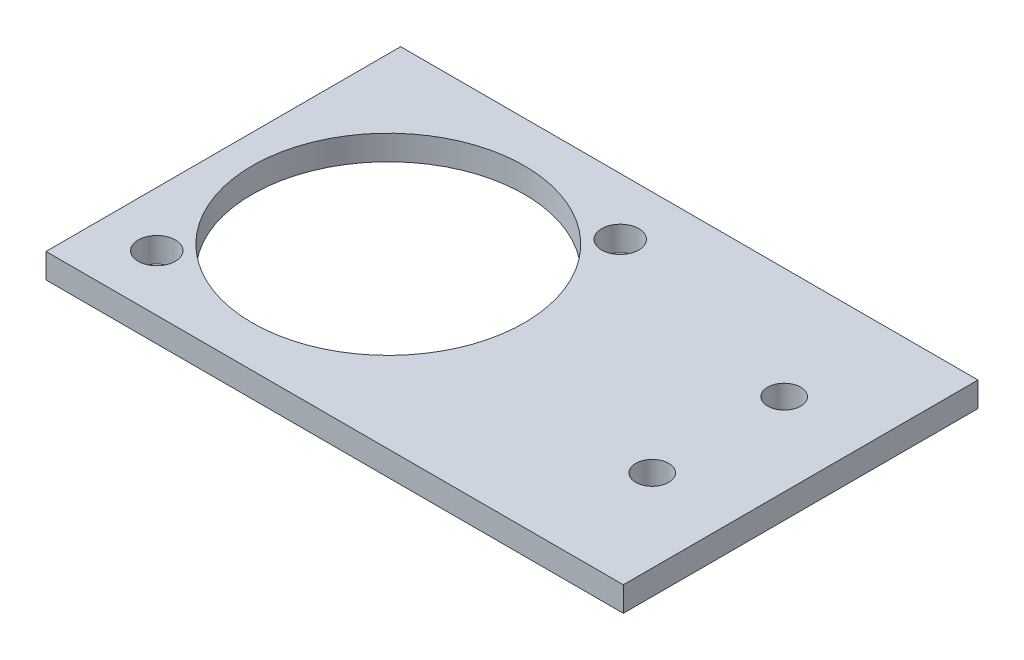
ISO-10303-21;
HEADER;
FILE_DESCRIPTION(('STEP AP214'),'2;1');
FILE_NAME('part.step','',(''),(''),'','','');
FILE_SCHEMA(('AUTOMOTIVE_DESIGN { 1 0 10303 214 1 1 1 1 }'));
ENDSEC;
DATA;
#1=APPLICATION_CONTEXT('core data for automotive mechanical design processes');
#2=APPLICATION_PROTOCOL_DEFINITION('international standard','automotive_design',2000,#1);
#3=PRODUCT_CONTEXT('',#1,'mechanical');
#4=PRODUCT('Part','Part','',(#3));
#5=PRODUCT_RELATED_PRODUCT_CATEGORY('part','',(#4));
#6=PRODUCT_DEFINITION_FORMATION('','',#4);
#7=PRODUCT_DEFINITION_CONTEXT('part definition',#1,'design');
#8=PRODUCT_DEFINITION('design','',#6,#7);
#9=PRODUCT_DEFINITION_SHAPE('','',#8);
#10=(LENGTH_UNIT() NAMED_UNIT(*) SI_UNIT(.MILLI.,.METRE.));
#11=(NAMED_UNIT(*) PLANE_ANGLE_UNIT() SI_UNIT($,.RADIAN.));
#12=(NAMED_UNIT(*) SI_UNIT($,.STERADIAN.) SOLID_ANGLE_UNIT());
#13=UNCERTAINTY_MEASURE_WITH_UNIT(LENGTH_MEASURE(1.E-05),#10,'distance_accuracy_value','');
#14=(GEOMETRIC_REPRESENTATION_CONTEXT(3) GLOBAL_UNCERTAINTY_ASSIGNED_CONTEXT((#13)) GLOBAL_UNIT_ASSIGNED_CONTEXT((#10,
#11,#12)) REPRESENTATION_CONTEXT('',''));
#15=CARTESIAN_POINT('',(0.,0.,0.));
#16=DIRECTION('',(0.,0.,1.));
#17=DIRECTION('',(1.,0.,0.));
#18=AXIS2_PLACEMENT_3D('',#15,#16,#17);
#19=CARTESIAN_POINT('',(0.,3.,0.));
#20=DIRECTION('',(0.,1.,0.));
#21=DIRECTION('',(0.,0.,1.));
#22=AXIS2_PLACEMENT_3D('',#19,#20,#21);
#23=PLANE('',#22);
#24=CARTESIAN_POINT('',(25.,3.,-8.));
#25=DIRECTION('',(0.,1.,0.));
#26=DIRECTION('',(0.,0.,1.));
#27=AXIS2_PLACEMENT_3D('',#24,#25,#26);
#28=CIRCLE('',#27,2.);
#29=CARTESIAN_POINT('',(25.,3.,-6.));
#30=VERTEX_POINT('',#29);
#31=EDGE_CURVE('E154',#30,#30,#28,.T.);
#32=ORIENTED_EDGE('',*,*,#31,.F.);
#33=EDGE_LOOP('',(#32));
#34=FACE_BOUND('',#33,.T.);
#35=CARTESIAN_POINT('',(-1.45999999999999,3.,-14.58));
#36=DIRECTION('',(0.,1.,0.));
#37=DIRECTION('',(0.,0.,1.));
#38=AXIS2_PLACEMENT_3D('',#35,#36,#37);
#39=CIRCLE('',#38,2.25);
#40=CARTESIAN_POINT('',(-1.45999999999999,3.,-12.33));
#41=VERTEX_POINT('',#40);
#42=EDGE_CURVE('E138',#41,#41,#39,.T.);
#43=ORIENTED_EDGE('',*,*,#42,.F.);
#44=EDGE_LOOP('',(#43));
#45=FACE_BOUND('',#44,.T.);
#46=DIRECTION('',(0.,0.,-1.));
#47=VECTOR('',#46,1.);
#48=CARTESIAN_POINT('',(35.,3.,-21.5));
#49=LINE('',#48,#47);
#50=CARTESIAN_POINT('',(35.,3.,21.5));
#51=VERTEX_POINT('',#50);
#52=CARTESIAN_POINT('',(35.,3.,-21.5));
#53=VERTEX_POINT('',#52);
#54=EDGE_CURVE('E96',#51,#53,#49,.T.);
#55=ORIENTED_EDGE('',*,*,#54,.T.);
#56=DIRECTION('',(-1.,0.,0.));
#57=VECTOR('',#56,1.);
#58=CARTESIAN_POINT('',(-35.,3.,-21.5));
#59=LINE('',#58,#57);
#60=CARTESIAN_POINT('',(-35.,3.,-21.5));
#61=VERTEX_POINT('',#60);
#62=EDGE_CURVE('E91',#53,#61,#59,.T.);
#63=ORIENTED_EDGE('',*,*,#62,.T.);
#64=DIRECTION('',(0.,0.,1.));
#65=VECTOR('',#64,1.);
#66=CARTESIAN_POINT('',(-35.,3.,-21.5));
#67=LINE('',#66,#65);
#68=CARTESIAN_POINT('',(-35.,3.,21.5));
#69=VERTEX_POINT('',#68);
#70=EDGE_CURVE('E94',#61,#69,#67,.T.);
#71=ORIENTED_EDGE('',*,*,#70,.T.);
#72=DIRECTION('',(1.,0.,0.));
#73=VECTOR('',#72,1.);
#74=CARTESIAN_POINT('',(-35.,3.,21.5));
#75=LINE('',#74,#73);
#76=EDGE_CURVE('E61',#69,#51,#75,.T.);
#77=ORIENTED_EDGE('',*,*,#76,.T.);
#78=EDGE_LOOP('',(#55,#63,#71,#77));
#79=FACE_BOUND('',#78,.T.);
#80=CARTESIAN_POINT('',(-15.,3.,0.));
#81=DIRECTION('',(0.,1.,0.));
#82=DIRECTION('',(0.,0.,1.));
#83=AXIS2_PLACEMENT_3D('',#80,#81,#82);
#84=CIRCLE('',#83,16.5);
#85=CARTESIAN_POINT('',(-15.,3.,16.5));
#86=VERTEX_POINT('',#85);
#87=EDGE_CURVE('E116',#86,#86,#84,.T.);
#88=ORIENTED_EDGE('',*,*,#87,.F.);
#89=EDGE_LOOP('',(#88));
#90=FACE_BOUND('',#89,.T.);
#91=CARTESIAN_POINT('',(-28.37,3.,14.7));
#92=DIRECTION('',(0.,1.,0.));
#93=DIRECTION('',(0.,0.,1.));
#94=AXIS2_PLACEMENT_3D('',#91,#92,#93);
#95=CIRCLE('',#94,2.25);
#96=CARTESIAN_POINT('',(-28.37,3.,16.95));
#97=VERTEX_POINT('',#96);
#98=EDGE_CURVE('E146',#97,#97,#95,.T.);
#99=ORIENTED_EDGE('',*,*,#98,.F.);
#100=EDGE_LOOP('',(#99));
#101=FACE_BOUND('',#100,.T.);
#102=CARTESIAN_POINT('',(25.,3.,8.));
#103=DIRECTION('',(0.,1.,0.));
#104=DIRECTION('',(0.,0.,1.));
#105=AXIS2_PLACEMENT_3D('',#102,#103,#104);
#106=CIRCLE('',#105,2.);
#107=CARTESIAN_POINT('',(25.,3.,10.));
#108=VERTEX_POINT('',#107);
#109=EDGE_CURVE('E162',#108,#108,#106,.T.);
#110=ORIENTED_EDGE('',*,*,#109,.F.);
#111=EDGE_LOOP('',(#110));
#112=FACE_BOUND('',#111,.T.);
#113=ADVANCED_FACE('F43',(#34,#45,#79,#90,#101,#112),#23,.T.);
#114=CARTESIAN_POINT('',(0.,0.,0.));
#115=DIRECTION('',(0.,1.,0.));
#116=DIRECTION('',(0.,0.,1.));
#117=AXIS2_PLACEMENT_3D('',#114,#115,#116);
#118=PLANE('',#117);
#119=DIRECTION('',(0.,0.,-1.));
#120=VECTOR('',#119,1.);
#121=CARTESIAN_POINT('',(35.,0.,-21.5));
#122=LINE('',#121,#120);
#123=CARTESIAN_POINT('',(35.,0.,21.5));
#124=VERTEX_POINT('',#123);
#125=CARTESIAN_POINT('',(35.,0.,-21.5));
#126=VERTEX_POINT('',#125);
#127=EDGE_CURVE('E112',#124,#126,#122,.T.);
#128=ORIENTED_EDGE('',*,*,#127,.F.);
#129=DIRECTION('',(1.,0.,0.));
#130=VECTOR('',#129,1.);
#131=CARTESIAN_POINT('',(-35.,0.,21.5));
#132=LINE('',#131,#130);
#133=CARTESIAN_POINT('',(-35.,0.,21.5));
#134=VERTEX_POINT('',#133);
#135=EDGE_CURVE('E84',#134,#124,#132,.T.);
#136=ORIENTED_EDGE('',*,*,#135,.F.);
#137=DIRECTION('',(0.,0.,1.));
#138=VECTOR('',#137,1.);
#139=CARTESIAN_POINT('',(-35.,0.,-21.5));
#140=LINE('',#139,#138);
#141=CARTESIAN_POINT('',(-35.,0.,-21.5));
#142=VERTEX_POINT('',#141);
#143=EDGE_CURVE('E78',#142,#134,#140,.T.);
#144=ORIENTED_EDGE('',*,*,#143,.F.);
#145=DIRECTION('',(-1.,0.,0.));
#146=VECTOR('',#145,1.);
#147=CARTESIAN_POINT('',(-35.,0.,-21.5));
#148=LINE('',#147,#146);
#149=EDGE_CURVE('E101',#126,#142,#148,.T.);
#150=ORIENTED_EDGE('',*,*,#149,.F.);
#151=EDGE_LOOP('',(#128,#136,#144,#150));
#152=FACE_BOUND('',#151,.T.);
#153=CARTESIAN_POINT('',(-15.,0.,0.));
#154=DIRECTION('',(0.,1.,0.));
#155=DIRECTION('',(0.,0.,1.));
#156=AXIS2_PLACEMENT_3D('',#153,#154,#155);
#157=CIRCLE('',#156,16.5);
#158=CARTESIAN_POINT('',(-15.,0.,16.5));
#159=VERTEX_POINT('',#158);
#160=EDGE_CURVE('E134',#159,#159,#157,.T.);
#161=ORIENTED_EDGE('',*,*,#160,.T.);
#162=EDGE_LOOP('',(#161));
#163=FACE_BOUND('',#162,.T.);
#164=CARTESIAN_POINT('',(-1.45999999999999,0.,-14.58));
#165=DIRECTION('',(0.,1.,0.));
#166=DIRECTION('',(0.,0.,1.));
#167=AXIS2_PLACEMENT_3D('',#164,#165,#166);
#168=CIRCLE('',#167,2.25);
#169=CARTESIAN_POINT('',(-1.45999999999999,0.,-12.33));
#170=VERTEX_POINT('',#169);
#171=EDGE_CURVE('E142',#170,#170,#168,.T.);
#172=ORIENTED_EDGE('',*,*,#171,.T.);
#173=EDGE_LOOP('',(#172));
#174=FACE_BOUND('',#173,.T.);
#175=CARTESIAN_POINT('',(-28.37,0.,14.7));
#176=DIRECTION('',(0.,1.,0.));
#177=DIRECTION('',(0.,0.,1.));
#178=AXIS2_PLACEMENT_3D('',#175,#176,#177);
#179=CIRCLE('',#178,2.25);
#180=CARTESIAN_POINT('',(-28.37,0.,16.95));
#181=VERTEX_POINT('',#180);
#182=EDGE_CURVE('E150',#181,#181,#179,.T.);
#183=ORIENTED_EDGE('',*,*,#182,.T.);
#184=EDGE_LOOP('',(#183));
#185=FACE_BOUND('',#184,.T.);
#186=CARTESIAN_POINT('',(25.,0.,-8.));
#187=DIRECTION('',(0.,1.,0.));
#188=DIRECTION('',(0.,0.,1.));
#189=AXIS2_PLACEMENT_3D('',#186,#187,#188);
#190=CIRCLE('',#189,2.);
#191=CARTESIAN_POINT('',(25.,0.,-6.));
#192=VERTEX_POINT('',#191);
#193=EDGE_CURVE('E158',#192,#192,#190,.T.);
#194=ORIENTED_EDGE('',*,*,#193,.T.);
#195=EDGE_LOOP('',(#194));
#196=FACE_BOUND('',#195,.T.);
#197=CARTESIAN_POINT('',(25.,0.,8.));
#198=DIRECTION('',(0.,1.,0.));
#199=DIRECTION('',(0.,0.,1.));
#200=AXIS2_PLACEMENT_3D('',#197,#198,#199);
#201=CIRCLE('',#200,2.);
#202=CARTESIAN_POINT('',(25.,0.,10.));
#203=VERTEX_POINT('',#202);
#204=EDGE_CURVE('E166',#203,#203,#201,.T.);
#205=ORIENTED_EDGE('',*,*,#204,.T.);
#206=EDGE_LOOP('',(#205));
#207=FACE_BOUND('',#206,.T.);
#208=ADVANCED_FACE('F129',(#152,#163,#174,#185,#196,#207),#118,.F.);
#209=CARTESIAN_POINT('',(35.,3.,-21.5));
#210=DIRECTION('',(-1.,0.,0.));
#211=DIRECTION('',(0.,0.,1.));
#212=AXIS2_PLACEMENT_3D('',#209,#210,#211);
#213=PLANE('',#212);
#214=ORIENTED_EDGE('',*,*,#127,.T.);
#215=DIRECTION('',(0.,-1.,0.));
#216=VECTOR('',#215,1.);
#217=CARTESIAN_POINT('',(35.,3.,-21.5));
#218=LINE('',#217,#216);
#219=EDGE_CURVE('E11',#53,#126,#218,.T.);
#220=ORIENTED_EDGE('',*,*,#219,.F.);
#221=ORIENTED_EDGE('',*,*,#54,.F.);
#222=DIRECTION('',(0.,-1.,0.));
#223=VECTOR('',#222,1.);
#224=CARTESIAN_POINT('',(35.,3.,21.5));
#225=LINE('',#224,#223);
#226=EDGE_CURVE('E108',#51,#124,#225,.T.);
#227=ORIENTED_EDGE('',*,*,#226,.T.);
#228=EDGE_LOOP('',(#214,#220,#221,#227));
#229=FACE_BOUND('',#228,.T.);
#230=ADVANCED_FACE('F45',(#229),#213,.F.);
#231=CARTESIAN_POINT('',(-35.,3.,-21.5));
#232=DIRECTION('',(0.,0.,1.));
#233=DIRECTION('',(1.,0.,0.));
#234=AXIS2_PLACEMENT_3D('',#231,#232,#233);
#235=PLANE('',#234);
#236=ORIENTED_EDGE('',*,*,#149,.T.);
#237=DIRECTION('',(0.,-1.,0.));
#238=VECTOR('',#237,1.);
#239=CARTESIAN_POINT('',(-35.,3.,-21.5));
#240=LINE('',#239,#238);
#241=EDGE_CURVE('E53',#61,#142,#240,.T.);
#242=ORIENTED_EDGE('',*,*,#241,.F.);
#243=ORIENTED_EDGE('',*,*,#62,.F.);
#244=ORIENTED_EDGE('',*,*,#219,.T.);
#245=EDGE_LOOP('',(#236,#242,#243,#244));
#246=FACE_BOUND('',#245,.T.);
#247=ADVANCED_FACE('F100',(#246),#235,.F.);
#248=CARTESIAN_POINT('',(-35.,3.,-21.5));
#249=DIRECTION('',(1.,0.,0.));
#250=DIRECTION('',(0.,0.,-1.));
#251=AXIS2_PLACEMENT_3D('',#248,#249,#250);
#252=PLANE('',#251);
#253=ORIENTED_EDGE('',*,*,#143,.T.);
#254=DIRECTION('',(0.,-1.,0.));
#255=VECTOR('',#254,1.);
#256=CARTESIAN_POINT('',(-35.,3.,21.5));
#257=LINE('',#256,#255);
#258=EDGE_CURVE('E103',#69,#134,#257,.T.);
#259=ORIENTED_EDGE('',*,*,#258,.F.);
#260=ORIENTED_EDGE('',*,*,#70,.F.);
#261=ORIENTED_EDGE('',*,*,#241,.T.);
#262=EDGE_LOOP('',(#253,#259,#260,#261));
#263=FACE_BOUND('',#262,.T.);
#264=ADVANCED_FACE('F104',(#263),#252,.F.);
#265=CARTESIAN_POINT('',(-35.,3.,21.5));
#266=DIRECTION('',(0.,0.,-1.));
#267=DIRECTION('',(-1.,0.,0.));
#268=AXIS2_PLACEMENT_3D('',#265,#266,#267);
#269=PLANE('',#268);
#270=ORIENTED_EDGE('',*,*,#135,.T.);
#271=ORIENTED_EDGE('',*,*,#226,.F.);
#272=ORIENTED_EDGE('',*,*,#76,.F.);
#273=ORIENTED_EDGE('',*,*,#258,.T.);
#274=EDGE_LOOP('',(#270,#271,#272,#273));
#275=FACE_BOUND('',#274,.T.);
#276=ADVANCED_FACE('F126',(#275),#269,.F.);
#277=CARTESIAN_POINT('',(-15.,3.,0.));
#278=DIRECTION('',(0.,-1.,0.));
#279=DIRECTION('',(0.,0.,-1.));
#280=AXIS2_PLACEMENT_3D('',#277,#278,#279);
#281=CYLINDRICAL_SURFACE('',#280,16.5);
#282=ORIENTED_EDGE('',*,*,#87,.T.);
#283=EDGE_LOOP('',(#282));
#284=FACE_BOUND('',#283,.T.);
#285=ORIENTED_EDGE('',*,*,#160,.F.);
#286=EDGE_LOOP('',(#285));
#287=FACE_BOUND('',#286,.T.);
#288=ADVANCED_FACE('F187',(#284,#287),#281,.F.);
#289=CARTESIAN_POINT('',(-1.45999999999999,3.,-14.58));
#290=DIRECTION('',(0.,-1.,0.));
#291=DIRECTION('',(0.,0.,-1.));
#292=AXIS2_PLACEMENT_3D('',#289,#290,#291);
#293=CYLINDRICAL_SURFACE('',#292,2.25);
#294=ORIENTED_EDGE('',*,*,#42,.T.);
#295=EDGE_LOOP('',(#294));
#296=FACE_BOUND('',#295,.T.);
#297=ORIENTED_EDGE('',*,*,#171,.F.);
#298=EDGE_LOOP('',(#297));
#299=FACE_BOUND('',#298,.T.);
#300=ADVANCED_FACE('F241',(#296,#299),#293,.F.);
#301=CARTESIAN_POINT('',(-28.37,3.,14.7));
#302=DIRECTION('',(0.,-1.,0.));
#303=DIRECTION('',(0.,0.,-1.));
#304=AXIS2_PLACEMENT_3D('',#301,#302,#303);
#305=CYLINDRICAL_SURFACE('',#304,2.25);
#306=ORIENTED_EDGE('',*,*,#98,.T.);
#307=EDGE_LOOP('',(#306));
#308=FACE_BOUND('',#307,.T.);
#309=ORIENTED_EDGE('',*,*,#182,.F.);
#310=EDGE_LOOP('',(#309));
#311=FACE_BOUND('',#310,.T.);
#312=ADVANCED_FACE('F250',(#308,#311),#305,.F.);
#313=CARTESIAN_POINT('',(25.,3.,-8.));
#314=DIRECTION('',(0.,-1.,0.));
#315=DIRECTION('',(0.,0.,-1.));
#316=AXIS2_PLACEMENT_3D('',#313,#314,#315);
#317=CYLINDRICAL_SURFACE('',#316,2.);
#318=ORIENTED_EDGE('',*,*,#31,.T.);
#319=EDGE_LOOP('',(#318));
#320=FACE_BOUND('',#319,.T.);
#321=ORIENTED_EDGE('',*,*,#193,.F.);
#322=EDGE_LOOP('',(#321));
#323=FACE_BOUND('',#322,.T.);
#324=ADVANCED_FACE('F259',(#320,#323),#317,.F.);
#325=CARTESIAN_POINT('',(25.,3.,8.));
#326=DIRECTION('',(0.,-1.,0.));
#327=DIRECTION('',(0.,0.,-1.));
#328=AXIS2_PLACEMENT_3D('',#325,#326,#327);
#329=CYLINDRICAL_SURFACE('',#328,2.);
#330=ORIENTED_EDGE('',*,*,#109,.T.);
#331=EDGE_LOOP('',(#330));
#332=FACE_BOUND('',#331,.T.);
#333=ORIENTED_EDGE('',*,*,#204,.F.);
#334=EDGE_LOOP('',(#333));
#335=FACE_BOUND('',#334,.T.);
#336=ADVANCED_FACE('F174',(#332,#335),#329,.F.);
#337=CLOSED_SHELL('',(#113,#208,#230,#247,#264,#276,#288,#300,#312,#324,#336));
#338=MANIFOLD_SOLID_BREP('B2',#337);
#339=ADVANCED_BREP_SHAPE_REPRESENTATION('',(#18,#338),#14);
#340=SHAPE_DEFINITION_REPRESENTATION(#9,#339);
ENDSEC;
END-ISO-10303-21;
